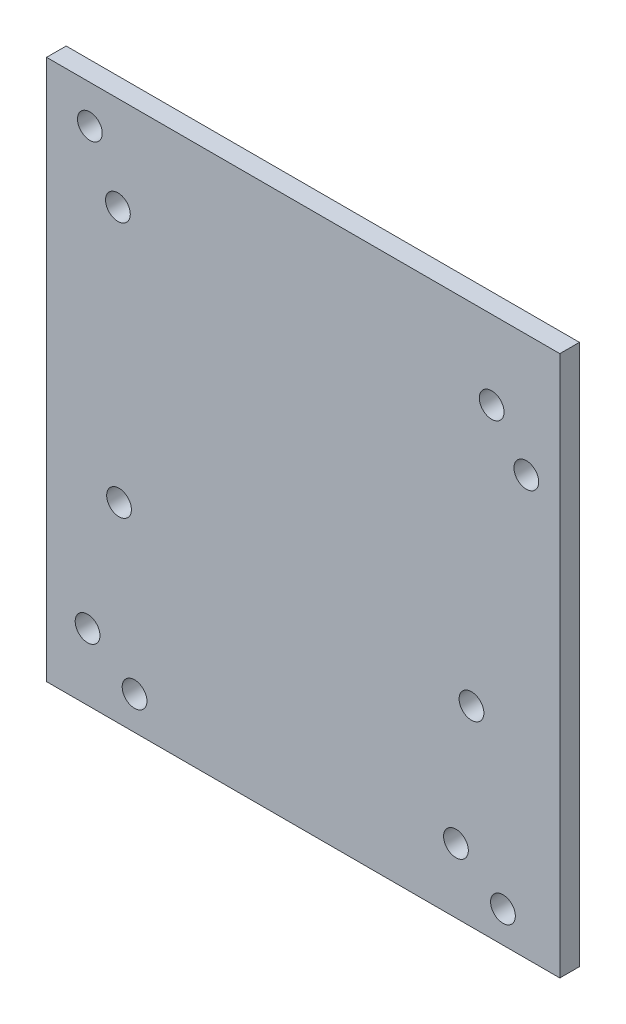
ISO-10303-21;
HEADER;
FILE_DESCRIPTION(('STEP AP214'),'2;1');
FILE_NAME('part.step','',(''),(''),'','','');
FILE_SCHEMA(('AUTOMOTIVE_DESIGN { 1 0 10303 214 1 1 1 1 }'));
ENDSEC;
DATA;
#1=APPLICATION_CONTEXT('core data for automotive mechanical design processes');
#2=APPLICATION_PROTOCOL_DEFINITION('international standard','automotive_design',2000,#1);
#3=PRODUCT_CONTEXT('',#1,'mechanical');
#4=PRODUCT('Part','Part','',(#3));
#5=PRODUCT_RELATED_PRODUCT_CATEGORY('part','',(#4));
#6=PRODUCT_DEFINITION_FORMATION('','',#4);
#7=PRODUCT_DEFINITION_CONTEXT('part definition',#1,'design');
#8=PRODUCT_DEFINITION('design','',#6,#7);
#9=PRODUCT_DEFINITION_SHAPE('','',#8);
#10=(LENGTH_UNIT() NAMED_UNIT(*) SI_UNIT(.MILLI.,.METRE.));
#11=(NAMED_UNIT(*) PLANE_ANGLE_UNIT() SI_UNIT($,.RADIAN.));
#12=(NAMED_UNIT(*) SI_UNIT($,.STERADIAN.) SOLID_ANGLE_UNIT());
#13=UNCERTAINTY_MEASURE_WITH_UNIT(LENGTH_MEASURE(1.E-05),#10,'distance_accuracy_value','');
#14=(GEOMETRIC_REPRESENTATION_CONTEXT(3) GLOBAL_UNCERTAINTY_ASSIGNED_CONTEXT((#13)) GLOBAL_UNIT_ASSIGNED_CONTEXT((#10,
#11,#12)) REPRESENTATION_CONTEXT('',''));
#15=CARTESIAN_POINT('',(0.,0.,0.));
#16=DIRECTION('',(0.,0.,1.));
#17=DIRECTION('',(1.,0.,0.));
#18=AXIS2_PLACEMENT_3D('',#15,#16,#17);
#19=CARTESIAN_POINT('',(0.,0.,-6.35));
#20=DIRECTION('',(0.,0.,1.));
#21=DIRECTION('',(-1.,0.,0.));
#22=AXIS2_PLACEMENT_3D('',#19,#20,#21);
#23=PLANE('',#22);
#24=DIRECTION('',(0.,1.,0.));
#25=VECTOR('',#24,1.);
#26=CARTESIAN_POINT('',(-529.711216697131,207.903265585856,-6.35));
#27=LINE('',#26,#25);
#28=CARTESIAN_POINT('',(-529.711216697131,207.903265585856,-6.35));
#29=VERTEX_POINT('',#28);
#30=CARTESIAN_POINT('',(-529.711216697131,383.2533201506,-6.35));
#31=VERTEX_POINT('',#30);
#32=EDGE_CURVE('E95',#29,#31,#27,.T.);
#33=ORIENTED_EDGE('',*,*,#32,.F.);
#34=DIRECTION('',(1.,0.,0.));
#35=VECTOR('',#34,1.);
#36=CARTESIAN_POINT('',(-696.157504886553,207.903265585856,-6.35));
#37=LINE('',#36,#35);
#38=CARTESIAN_POINT('',(-696.157504886553,207.903265585856,-6.35));
#39=VERTEX_POINT('',#38);
#40=EDGE_CURVE('E98',#39,#29,#37,.T.);
#41=ORIENTED_EDGE('',*,*,#40,.F.);
#42=DIRECTION('',(0.,-1.,0.));
#43=VECTOR('',#42,1.);
#44=CARTESIAN_POINT('',(-696.157504886553,207.903265585856,-6.35));
#45=LINE('',#44,#43);
#46=CARTESIAN_POINT('',(-696.157504886553,383.2533201506,-6.35));
#47=VERTEX_POINT('',#46);
#48=EDGE_CURVE('E86',#47,#39,#45,.T.);
#49=ORIENTED_EDGE('',*,*,#48,.F.);
#50=DIRECTION('',(-1.,0.,0.));
#51=VECTOR('',#50,1.);
#52=CARTESIAN_POINT('',(-696.157504886553,383.2533201506,-6.35));
#53=LINE('',#52,#51);
#54=EDGE_CURVE('E91',#31,#47,#53,.T.);
#55=ORIENTED_EDGE('',*,*,#54,.F.);
#56=EDGE_LOOP('',(#33,#41,#49,#55));
#57=FACE_BOUND('',#56,.T.);
#58=CARTESIAN_POINT('',(-667.625800723058,218.698265585856,-6.35));
#59=DIRECTION('',(0.,0.,1.));
#60=DIRECTION('',(1.,0.,0.));
#61=AXIS2_PLACEMENT_3D('',#58,#59,#60);
#62=CIRCLE('',#61,4.01269999999997);
#63=CARTESIAN_POINT('',(-663.613100723058,218.698265585856,-6.35));
#64=VERTEX_POINT('',#63);
#65=EDGE_CURVE('E107',#64,#64,#62,.T.);
#66=ORIENTED_EDGE('',*,*,#65,.T.);
#67=EDGE_LOOP('',(#66));
#68=FACE_BOUND('',#67,.T.);
#69=CARTESIAN_POINT('',(-682.865800723058,229.493265585856,-6.35));
#70=DIRECTION('',(0.,0.,1.));
#71=DIRECTION('',(1.,0.,0.));
#72=AXIS2_PLACEMENT_3D('',#69,#70,#71);
#73=CIRCLE('',#72,4.01269999999997);
#74=CARTESIAN_POINT('',(-678.853100723058,229.493265585856,-6.35));
#75=VERTEX_POINT('',#74);
#76=EDGE_CURVE('E118',#75,#75,#73,.T.);
#77=ORIENTED_EDGE('',*,*,#76,.T.);
#78=EDGE_LOOP('',(#77));
#79=FACE_BOUND('',#78,.T.);
#80=CARTESIAN_POINT('',(-682.121778023771,370.932816424034,-6.35));
#81=DIRECTION('',(0.,0.,1.));
#82=DIRECTION('',(1.,0.,0.));
#83=AXIS2_PLACEMENT_3D('',#80,#81,#82);
#84=CIRCLE('',#83,4.01270000000008);
#85=CARTESIAN_POINT('',(-678.109078023771,370.932816424034,-6.35));
#86=VERTEX_POINT('',#85);
#87=EDGE_CURVE('E124',#86,#86,#84,.T.);
#88=ORIENTED_EDGE('',*,*,#87,.T.);
#89=EDGE_LOOP('',(#88));
#90=FACE_BOUND('',#89,.T.);
#91=CARTESIAN_POINT('',(-673.025414387742,352.751458014907,-6.35));
#92=DIRECTION('',(0.,0.,1.));
#93=DIRECTION('',(1.,0.,0.));
#94=AXIS2_PLACEMENT_3D('',#91,#92,#93);
#95=CIRCLE('',#94,4.01270000000008);
#96=CARTESIAN_POINT('',(-669.012714387742,352.751458014907,-6.35));
#97=VERTEX_POINT('',#96);
#98=EDGE_CURVE('E130',#97,#97,#95,.T.);
#99=ORIENTED_EDGE('',*,*,#98,.T.);
#100=EDGE_LOOP('',(#99));
#101=FACE_BOUND('',#100,.T.);
#102=CARTESIAN_POINT('',(-551.816021725944,357.766762234083,-6.35));
#103=DIRECTION('',(0.,0.,1.));
#104=DIRECTION('',(1.,0.,0.));
#105=AXIS2_PLACEMENT_3D('',#102,#103,#104);
#106=CIRCLE('',#105,4.01270000000008);
#107=CARTESIAN_POINT('',(-547.803321725944,357.766762234083,-6.35));
#108=VERTEX_POINT('',#107);
#109=EDGE_CURVE('E136',#108,#108,#106,.T.);
#110=ORIENTED_EDGE('',*,*,#109,.T.);
#111=EDGE_LOOP('',(#110));
#112=FACE_BOUND('',#111,.T.);
#113=CARTESIAN_POINT('',(-540.572963717979,343.760561941729,-6.35));
#114=DIRECTION('',(0.,0.,1.));
#115=DIRECTION('',(1.,0.,0.));
#116=AXIS2_PLACEMENT_3D('',#113,#114,#115);
#117=CIRCLE('',#116,4.01270000000008);
#118=CARTESIAN_POINT('',(-536.560263717979,343.760561941729,-6.35));
#119=VERTEX_POINT('',#118);
#120=EDGE_CURVE('E142',#119,#119,#117,.T.);
#121=ORIENTED_EDGE('',*,*,#120,.T.);
#122=EDGE_LOOP('',(#121));
#123=FACE_BOUND('',#122,.T.);
#124=CARTESIAN_POINT('',(-548.156926739575,218.063265585856,-6.35));
#125=DIRECTION('',(0.,0.,1.));
#126=DIRECTION('',(1.,0.,0.));
#127=AXIS2_PLACEMENT_3D('',#124,#125,#126);
#128=CIRCLE('',#127,4.01270000000008);
#129=CARTESIAN_POINT('',(-544.144226739575,218.063265585856,-6.35));
#130=VERTEX_POINT('',#129);
#131=EDGE_CURVE('E148',#130,#130,#128,.T.);
#132=ORIENTED_EDGE('',*,*,#131,.T.);
#133=EDGE_LOOP('',(#132));
#134=FACE_BOUND('',#133,.T.);
#135=CARTESIAN_POINT('',(-563.396926739575,228.858265585856,-6.35));
#136=DIRECTION('',(0.,0.,1.));
#137=DIRECTION('',(1.,0.,0.));
#138=AXIS2_PLACEMENT_3D('',#135,#136,#137);
#139=CIRCLE('',#138,4.01270000000008);
#140=CARTESIAN_POINT('',(-559.384226739575,228.858265585856,-6.35));
#141=VERTEX_POINT('',#140);
#142=EDGE_CURVE('E154',#141,#141,#139,.T.);
#143=ORIENTED_EDGE('',*,*,#142,.T.);
#144=EDGE_LOOP('',(#143));
#145=FACE_BOUND('',#144,.T.);
#146=CARTESIAN_POINT('',(-558.361573731319,269.97258035059,-6.35));
#147=DIRECTION('',(0.,0.,1.));
#148=DIRECTION('',(1.,0.,0.));
#149=AXIS2_PLACEMENT_3D('',#146,#147,#148);
#150=CIRCLE('',#149,4.01320000000002);
#151=CARTESIAN_POINT('',(-554.348373731319,269.97258035059,-6.35));
#152=VERTEX_POINT('',#151);
#153=EDGE_CURVE('E160',#152,#152,#150,.T.);
#154=ORIENTED_EDGE('',*,*,#153,.T.);
#155=EDGE_LOOP('',(#154));
#156=FACE_BOUND('',#155,.T.);
#157=CARTESIAN_POINT('',(-672.661153731319,269.972580350589,-6.35));
#158=DIRECTION('',(0.,0.,1.));
#159=DIRECTION('',(1.,0.,0.));
#160=AXIS2_PLACEMENT_3D('',#157,#158,#159);
#161=CIRCLE('',#160,4.01320000000002);
#162=CARTESIAN_POINT('',(-668.647953731319,269.972580350589,-6.35));
#163=VERTEX_POINT('',#162);
#164=EDGE_CURVE('E166',#163,#163,#161,.T.);
#165=ORIENTED_EDGE('',*,*,#164,.T.);
#166=EDGE_LOOP('',(#165));
#167=FACE_BOUND('',#166,.T.);
#168=ADVANCED_FACE('F39',(#57,#68,#79,#90,#101,#112,#123,#134,#145,#156,#167),#23,.F.);
#169=CARTESIAN_POINT('',(0.,0.,0.));
#170=DIRECTION('',(0.,0.,1.));
#171=DIRECTION('',(-1.,0.,0.));
#172=AXIS2_PLACEMENT_3D('',#169,#170,#171);
#173=PLANE('',#172);
#174=CARTESIAN_POINT('',(-558.361573731319,269.97258035059,0.));
#175=DIRECTION('',(0.,0.,1.));
#176=DIRECTION('',(1.,0.,0.));
#177=AXIS2_PLACEMENT_3D('',#174,#175,#176);
#178=CIRCLE('',#177,4.01320000000002);
#179=CARTESIAN_POINT('',(-554.348373731319,269.97258035059,0.));
#180=VERTEX_POINT('',#179);
#181=EDGE_CURVE('E163',#180,#180,#178,.T.);
#182=ORIENTED_EDGE('',*,*,#181,.F.);
#183=EDGE_LOOP('',(#182));
#184=FACE_BOUND('',#183,.T.);
#185=CARTESIAN_POINT('',(-548.156926739575,218.063265585856,0.));
#186=DIRECTION('',(0.,0.,1.));
#187=DIRECTION('',(1.,0.,0.));
#188=AXIS2_PLACEMENT_3D('',#185,#186,#187);
#189=CIRCLE('',#188,4.01270000000008);
#190=CARTESIAN_POINT('',(-544.144226739575,218.063265585856,0.));
#191=VERTEX_POINT('',#190);
#192=EDGE_CURVE('E151',#191,#191,#189,.T.);
#193=ORIENTED_EDGE('',*,*,#192,.F.);
#194=EDGE_LOOP('',(#193));
#195=FACE_BOUND('',#194,.T.);
#196=CARTESIAN_POINT('',(-551.816021725944,357.766762234083,0.));
#197=DIRECTION('',(0.,0.,1.));
#198=DIRECTION('',(1.,0.,0.));
#199=AXIS2_PLACEMENT_3D('',#196,#197,#198);
#200=CIRCLE('',#199,4.01270000000008);
#201=CARTESIAN_POINT('',(-547.803321725944,357.766762234083,0.));
#202=VERTEX_POINT('',#201);
#203=EDGE_CURVE('E139',#202,#202,#200,.T.);
#204=ORIENTED_EDGE('',*,*,#203,.F.);
#205=EDGE_LOOP('',(#204));
#206=FACE_BOUND('',#205,.T.);
#207=CARTESIAN_POINT('',(-682.121778023771,370.932816424034,0.));
#208=DIRECTION('',(0.,0.,1.));
#209=DIRECTION('',(1.,0.,0.));
#210=AXIS2_PLACEMENT_3D('',#207,#208,#209);
#211=CIRCLE('',#210,4.01270000000008);
#212=CARTESIAN_POINT('',(-678.109078023771,370.932816424034,0.));
#213=VERTEX_POINT('',#212);
#214=EDGE_CURVE('E127',#213,#213,#211,.T.);
#215=ORIENTED_EDGE('',*,*,#214,.F.);
#216=EDGE_LOOP('',(#215));
#217=FACE_BOUND('',#216,.T.);
#218=CARTESIAN_POINT('',(-667.625800723058,218.698265585856,0.));
#219=DIRECTION('',(0.,0.,1.));
#220=DIRECTION('',(1.,0.,0.));
#221=AXIS2_PLACEMENT_3D('',#218,#219,#220);
#222=CIRCLE('',#221,4.01269999999997);
#223=CARTESIAN_POINT('',(-663.613100723058,218.698265585856,0.));
#224=VERTEX_POINT('',#223);
#225=EDGE_CURVE('E115',#224,#224,#222,.T.);
#226=ORIENTED_EDGE('',*,*,#225,.F.);
#227=EDGE_LOOP('',(#226));
#228=FACE_BOUND('',#227,.T.);
#229=DIRECTION('',(0.,1.,0.));
#230=VECTOR('',#229,1.);
#231=CARTESIAN_POINT('',(-529.711216697131,207.903265585856,0.));
#232=LINE('',#231,#230);
#233=CARTESIAN_POINT('',(-529.711216697131,207.903265585856,0.));
#234=VERTEX_POINT('',#233);
#235=CARTESIAN_POINT('',(-529.711216697131,383.2533201506,0.));
#236=VERTEX_POINT('',#235);
#237=EDGE_CURVE('E103',#234,#236,#232,.T.);
#238=ORIENTED_EDGE('',*,*,#237,.T.);
#239=DIRECTION('',(-1.,0.,0.));
#240=VECTOR('',#239,1.);
#241=CARTESIAN_POINT('',(-696.157504886553,383.2533201506,0.));
#242=LINE('',#241,#240);
#243=CARTESIAN_POINT('',(-696.157504886553,383.2533201506,0.));
#244=VERTEX_POINT('',#243);
#245=EDGE_CURVE('E106',#236,#244,#242,.T.);
#246=ORIENTED_EDGE('',*,*,#245,.T.);
#247=DIRECTION('',(0.,-1.,0.));
#248=VECTOR('',#247,1.);
#249=CARTESIAN_POINT('',(-696.157504886553,207.903265585856,0.));
#250=LINE('',#249,#248);
#251=CARTESIAN_POINT('',(-696.157504886553,207.903265585856,0.));
#252=VERTEX_POINT('',#251);
#253=EDGE_CURVE('E89',#244,#252,#250,.T.);
#254=ORIENTED_EDGE('',*,*,#253,.T.);
#255=DIRECTION('',(1.,0.,0.));
#256=VECTOR('',#255,1.);
#257=CARTESIAN_POINT('',(-696.157504886553,207.903265585856,0.));
#258=LINE('',#257,#256);
#259=EDGE_CURVE('E110',#252,#234,#258,.T.);
#260=ORIENTED_EDGE('',*,*,#259,.T.);
#261=EDGE_LOOP('',(#238,#246,#254,#260));
#262=FACE_BOUND('',#261,.T.);
#263=CARTESIAN_POINT('',(-682.865800723058,229.493265585856,0.));
#264=DIRECTION('',(0.,0.,1.));
#265=DIRECTION('',(1.,0.,0.));
#266=AXIS2_PLACEMENT_3D('',#263,#264,#265);
#267=CIRCLE('',#266,4.01269999999997);
#268=CARTESIAN_POINT('',(-678.853100723058,229.493265585856,0.));
#269=VERTEX_POINT('',#268);
#270=EDGE_CURVE('E121',#269,#269,#267,.T.);
#271=ORIENTED_EDGE('',*,*,#270,.F.);
#272=EDGE_LOOP('',(#271));
#273=FACE_BOUND('',#272,.T.);
#274=CARTESIAN_POINT('',(-673.025414387742,352.751458014907,0.));
#275=DIRECTION('',(0.,0.,1.));
#276=DIRECTION('',(1.,0.,0.));
#277=AXIS2_PLACEMENT_3D('',#274,#275,#276);
#278=CIRCLE('',#277,4.01270000000008);
#279=CARTESIAN_POINT('',(-669.012714387742,352.751458014907,0.));
#280=VERTEX_POINT('',#279);
#281=EDGE_CURVE('E133',#280,#280,#278,.T.);
#282=ORIENTED_EDGE('',*,*,#281,.F.);
#283=EDGE_LOOP('',(#282));
#284=FACE_BOUND('',#283,.T.);
#285=CARTESIAN_POINT('',(-540.572963717979,343.760561941729,0.));
#286=DIRECTION('',(0.,0.,1.));
#287=DIRECTION('',(1.,0.,0.));
#288=AXIS2_PLACEMENT_3D('',#285,#286,#287);
#289=CIRCLE('',#288,4.01270000000008);
#290=CARTESIAN_POINT('',(-536.560263717979,343.760561941729,0.));
#291=VERTEX_POINT('',#290);
#292=EDGE_CURVE('E145',#291,#291,#289,.T.);
#293=ORIENTED_EDGE('',*,*,#292,.F.);
#294=EDGE_LOOP('',(#293));
#295=FACE_BOUND('',#294,.T.);
#296=CARTESIAN_POINT('',(-563.396926739575,228.858265585856,0.));
#297=DIRECTION('',(0.,0.,1.));
#298=DIRECTION('',(1.,0.,0.));
#299=AXIS2_PLACEMENT_3D('',#296,#297,#298);
#300=CIRCLE('',#299,4.01270000000008);
#301=CARTESIAN_POINT('',(-559.384226739575,228.858265585856,0.));
#302=VERTEX_POINT('',#301);
#303=EDGE_CURVE('E157',#302,#302,#300,.T.);
#304=ORIENTED_EDGE('',*,*,#303,.F.);
#305=EDGE_LOOP('',(#304));
#306=FACE_BOUND('',#305,.T.);
#307=CARTESIAN_POINT('',(-672.661153731319,269.972580350589,0.));
#308=DIRECTION('',(0.,0.,1.));
#309=DIRECTION('',(1.,0.,0.));
#310=AXIS2_PLACEMENT_3D('',#307,#308,#309);
#311=CIRCLE('',#310,4.01320000000002);
#312=CARTESIAN_POINT('',(-668.647953731319,269.972580350589,0.));
#313=VERTEX_POINT('',#312);
#314=EDGE_CURVE('E169',#313,#313,#311,.T.);
#315=ORIENTED_EDGE('',*,*,#314,.F.);
#316=EDGE_LOOP('',(#315));
#317=FACE_BOUND('',#316,.T.);
#318=ADVANCED_FACE('F183',(#184,#195,#206,#217,#228,#262,#273,#284,#295,#306,#317),#173,.T.);
#319=CARTESIAN_POINT('',(-529.711216697131,207.903265585856,-6.35));
#320=DIRECTION('',(-1.,0.,0.));
#321=DIRECTION('',(0.,0.,-1.));
#322=AXIS2_PLACEMENT_3D('',#319,#320,#321);
#323=PLANE('',#322);
#324=ORIENTED_EDGE('',*,*,#237,.F.);
#325=DIRECTION('',(0.,0.,1.));
#326=VECTOR('',#325,1.);
#327=CARTESIAN_POINT('',(-529.711216697131,207.903265585856,-6.35));
#328=LINE('',#327,#326);
#329=EDGE_CURVE('E56',#29,#234,#328,.T.);
#330=ORIENTED_EDGE('',*,*,#329,.F.);
#331=ORIENTED_EDGE('',*,*,#32,.T.);
#332=DIRECTION('',(0.,0.,1.));
#333=VECTOR('',#332,1.);
#334=CARTESIAN_POINT('',(-529.711216697131,383.2533201506,-6.35));
#335=LINE('',#334,#333);
#336=EDGE_CURVE('E11',#31,#236,#335,.T.);
#337=ORIENTED_EDGE('',*,*,#336,.T.);
#338=EDGE_LOOP('',(#324,#330,#331,#337));
#339=FACE_BOUND('',#338,.T.);
#340=ADVANCED_FACE('F41',(#339),#323,.F.);
#341=CARTESIAN_POINT('',(-696.157504886553,383.2533201506,-6.35));
#342=DIRECTION('',(0.,-1.,0.));
#343=DIRECTION('',(0.,0.,1.));
#344=AXIS2_PLACEMENT_3D('',#341,#342,#343);
#345=PLANE('',#344);
#346=ORIENTED_EDGE('',*,*,#245,.F.);
#347=ORIENTED_EDGE('',*,*,#336,.F.);
#348=ORIENTED_EDGE('',*,*,#54,.T.);
#349=DIRECTION('',(0.,0.,1.));
#350=VECTOR('',#349,1.);
#351=CARTESIAN_POINT('',(-696.157504886553,383.2533201506,-6.35));
#352=LINE('',#351,#350);
#353=EDGE_CURVE('E48',#47,#244,#352,.T.);
#354=ORIENTED_EDGE('',*,*,#353,.T.);
#355=EDGE_LOOP('',(#346,#347,#348,#354));
#356=FACE_BOUND('',#355,.T.);
#357=ADVANCED_FACE('F92',(#356),#345,.F.);
#358=CARTESIAN_POINT('',(-696.157504886553,207.903265585856,-6.35));
#359=DIRECTION('',(1.,0.,0.));
#360=DIRECTION('',(0.,0.,1.));
#361=AXIS2_PLACEMENT_3D('',#358,#359,#360);
#362=PLANE('',#361);
#363=ORIENTED_EDGE('',*,*,#253,.F.);
#364=ORIENTED_EDGE('',*,*,#353,.F.);
#365=ORIENTED_EDGE('',*,*,#48,.T.);
#366=DIRECTION('',(0.,0.,1.));
#367=VECTOR('',#366,1.);
#368=CARTESIAN_POINT('',(-696.157504886553,207.903265585856,-6.35));
#369=LINE('',#368,#367);
#370=EDGE_CURVE('E72',#39,#252,#369,.T.);
#371=ORIENTED_EDGE('',*,*,#370,.T.);
#372=EDGE_LOOP('',(#363,#364,#365,#371));
#373=FACE_BOUND('',#372,.T.);
#374=ADVANCED_FACE('F84',(#373),#362,.F.);
#375=CARTESIAN_POINT('',(-696.157504886553,207.903265585856,-6.35));
#376=DIRECTION('',(0.,1.,0.));
#377=DIRECTION('',(0.,0.,-1.));
#378=AXIS2_PLACEMENT_3D('',#375,#376,#377);
#379=PLANE('',#378);
#380=ORIENTED_EDGE('',*,*,#259,.F.);
#381=ORIENTED_EDGE('',*,*,#370,.F.);
#382=ORIENTED_EDGE('',*,*,#40,.T.);
#383=ORIENTED_EDGE('',*,*,#329,.T.);
#384=EDGE_LOOP('',(#380,#381,#382,#383));
#385=FACE_BOUND('',#384,.T.);
#386=ADVANCED_FACE('F196',(#385),#379,.F.);
#387=CARTESIAN_POINT('',(-667.625800723058,218.698265585856,-6.35));
#388=DIRECTION('',(0.,0.,1.));
#389=DIRECTION('',(-1.,0.,0.));
#390=AXIS2_PLACEMENT_3D('',#387,#388,#389);
#391=CYLINDRICAL_SURFACE('',#390,4.01269999999997);
#392=ORIENTED_EDGE('',*,*,#65,.F.);
#393=EDGE_LOOP('',(#392));
#394=FACE_BOUND('',#393,.T.);
#395=ORIENTED_EDGE('',*,*,#225,.T.);
#396=EDGE_LOOP('',(#395));
#397=FACE_BOUND('',#396,.T.);
#398=ADVANCED_FACE('F199',(#394,#397),#391,.F.);
#399=CARTESIAN_POINT('',(-682.865800723058,229.493265585856,-6.35));
#400=DIRECTION('',(0.,0.,1.));
#401=DIRECTION('',(-1.,0.,0.));
#402=AXIS2_PLACEMENT_3D('',#399,#400,#401);
#403=CYLINDRICAL_SURFACE('',#402,4.01269999999997);
#404=ORIENTED_EDGE('',*,*,#76,.F.);
#405=EDGE_LOOP('',(#404));
#406=FACE_BOUND('',#405,.T.);
#407=ORIENTED_EDGE('',*,*,#270,.T.);
#408=EDGE_LOOP('',(#407));
#409=FACE_BOUND('',#408,.T.);
#410=ADVANCED_FACE('F220',(#406,#409),#403,.F.);
#411=CARTESIAN_POINT('',(-682.121778023771,370.932816424034,-6.35));
#412=DIRECTION('',(0.,0.,1.));
#413=DIRECTION('',(-1.,0.,0.));
#414=AXIS2_PLACEMENT_3D('',#411,#412,#413);
#415=CYLINDRICAL_SURFACE('',#414,4.01270000000008);
#416=ORIENTED_EDGE('',*,*,#87,.F.);
#417=EDGE_LOOP('',(#416));
#418=FACE_BOUND('',#417,.T.);
#419=ORIENTED_EDGE('',*,*,#214,.T.);
#420=EDGE_LOOP('',(#419));
#421=FACE_BOUND('',#420,.T.);
#422=ADVANCED_FACE('F227',(#418,#421),#415,.F.);
#423=CARTESIAN_POINT('',(-673.025414387742,352.751458014907,-6.35));
#424=DIRECTION('',(0.,0.,1.));
#425=DIRECTION('',(-1.,0.,0.));
#426=AXIS2_PLACEMENT_3D('',#423,#424,#425);
#427=CYLINDRICAL_SURFACE('',#426,4.01270000000008);
#428=ORIENTED_EDGE('',*,*,#98,.F.);
#429=EDGE_LOOP('',(#428));
#430=FACE_BOUND('',#429,.T.);
#431=ORIENTED_EDGE('',*,*,#281,.T.);
#432=EDGE_LOOP('',(#431));
#433=FACE_BOUND('',#432,.T.);
#434=ADVANCED_FACE('F235',(#430,#433),#427,.F.);
#435=CARTESIAN_POINT('',(-551.816021725944,357.766762234083,-6.35));
#436=DIRECTION('',(0.,0.,1.));
#437=DIRECTION('',(-1.,0.,0.));
#438=AXIS2_PLACEMENT_3D('',#435,#436,#437);
#439=CYLINDRICAL_SURFACE('',#438,4.01270000000008);
#440=ORIENTED_EDGE('',*,*,#109,.F.);
#441=EDGE_LOOP('',(#440));
#442=FACE_BOUND('',#441,.T.);
#443=ORIENTED_EDGE('',*,*,#203,.T.);
#444=EDGE_LOOP('',(#443));
#445=FACE_BOUND('',#444,.T.);
#446=ADVANCED_FACE('F243',(#442,#445),#439,.F.);
#447=CARTESIAN_POINT('',(-540.572963717979,343.760561941729,-6.35));
#448=DIRECTION('',(0.,0.,1.));
#449=DIRECTION('',(-1.,0.,0.));
#450=AXIS2_PLACEMENT_3D('',#447,#448,#449);
#451=CYLINDRICAL_SURFACE('',#450,4.01270000000008);
#452=ORIENTED_EDGE('',*,*,#120,.F.);
#453=EDGE_LOOP('',(#452));
#454=FACE_BOUND('',#453,.T.);
#455=ORIENTED_EDGE('',*,*,#292,.T.);
#456=EDGE_LOOP('',(#455));
#457=FACE_BOUND('',#456,.T.);
#458=ADVANCED_FACE('F251',(#454,#457),#451,.F.);
#459=CARTESIAN_POINT('',(-548.156926739575,218.063265585856,-6.35));
#460=DIRECTION('',(0.,0.,1.));
#461=DIRECTION('',(-1.,0.,0.));
#462=AXIS2_PLACEMENT_3D('',#459,#460,#461);
#463=CYLINDRICAL_SURFACE('',#462,4.01270000000008);
#464=ORIENTED_EDGE('',*,*,#131,.F.);
#465=EDGE_LOOP('',(#464));
#466=FACE_BOUND('',#465,.T.);
#467=ORIENTED_EDGE('',*,*,#192,.T.);
#468=EDGE_LOOP('',(#467));
#469=FACE_BOUND('',#468,.T.);
#470=ADVANCED_FACE('F259',(#466,#469),#463,.F.);
#471=CARTESIAN_POINT('',(-563.396926739575,228.858265585856,-6.35));
#472=DIRECTION('',(0.,0.,1.));
#473=DIRECTION('',(-1.,0.,0.));
#474=AXIS2_PLACEMENT_3D('',#471,#472,#473);
#475=CYLINDRICAL_SURFACE('',#474,4.01270000000008);
#476=ORIENTED_EDGE('',*,*,#142,.F.);
#477=EDGE_LOOP('',(#476));
#478=FACE_BOUND('',#477,.T.);
#479=ORIENTED_EDGE('',*,*,#303,.T.);
#480=EDGE_LOOP('',(#479));
#481=FACE_BOUND('',#480,.T.);
#482=ADVANCED_FACE('F267',(#478,#481),#475,.F.);
#483=CARTESIAN_POINT('',(-558.361573731319,269.97258035059,-6.35));
#484=DIRECTION('',(0.,0.,1.));
#485=DIRECTION('',(-1.,0.,0.));
#486=AXIS2_PLACEMENT_3D('',#483,#484,#485);
#487=CYLINDRICAL_SURFACE('',#486,4.01320000000002);
#488=ORIENTED_EDGE('',*,*,#153,.F.);
#489=EDGE_LOOP('',(#488));
#490=FACE_BOUND('',#489,.T.);
#491=ORIENTED_EDGE('',*,*,#181,.T.);
#492=EDGE_LOOP('',(#491));
#493=FACE_BOUND('',#492,.T.);
#494=ADVANCED_FACE('F179',(#490,#493),#487,.F.);
#495=CARTESIAN_POINT('',(-672.661153731319,269.972580350589,-6.35));
#496=DIRECTION('',(0.,0.,1.));
#497=DIRECTION('',(-1.,0.,0.));
#498=AXIS2_PLACEMENT_3D('',#495,#496,#497);
#499=CYLINDRICAL_SURFACE('',#498,4.01320000000002);
#500=ORIENTED_EDGE('',*,*,#164,.F.);
#501=EDGE_LOOP('',(#500));
#502=FACE_BOUND('',#501,.T.);
#503=ORIENTED_EDGE('',*,*,#314,.T.);
#504=EDGE_LOOP('',(#503));
#505=FACE_BOUND('',#504,.T.);
#506=ADVANCED_FACE('F176',(#502,#505),#499,.F.);
#507=CLOSED_SHELL('',(#168,#318,#340,#357,#374,#386,#398,#410,#422,#434,#446,#458,#470,#482,
#494,#506));
#508=MANIFOLD_SOLID_BREP('B2',#507);
#509=ADVANCED_BREP_SHAPE_REPRESENTATION('',(#18,#508),#14);
#510=SHAPE_DEFINITION_REPRESENTATION(#9,#509);
ENDSEC;
END-ISO-10303-21;
